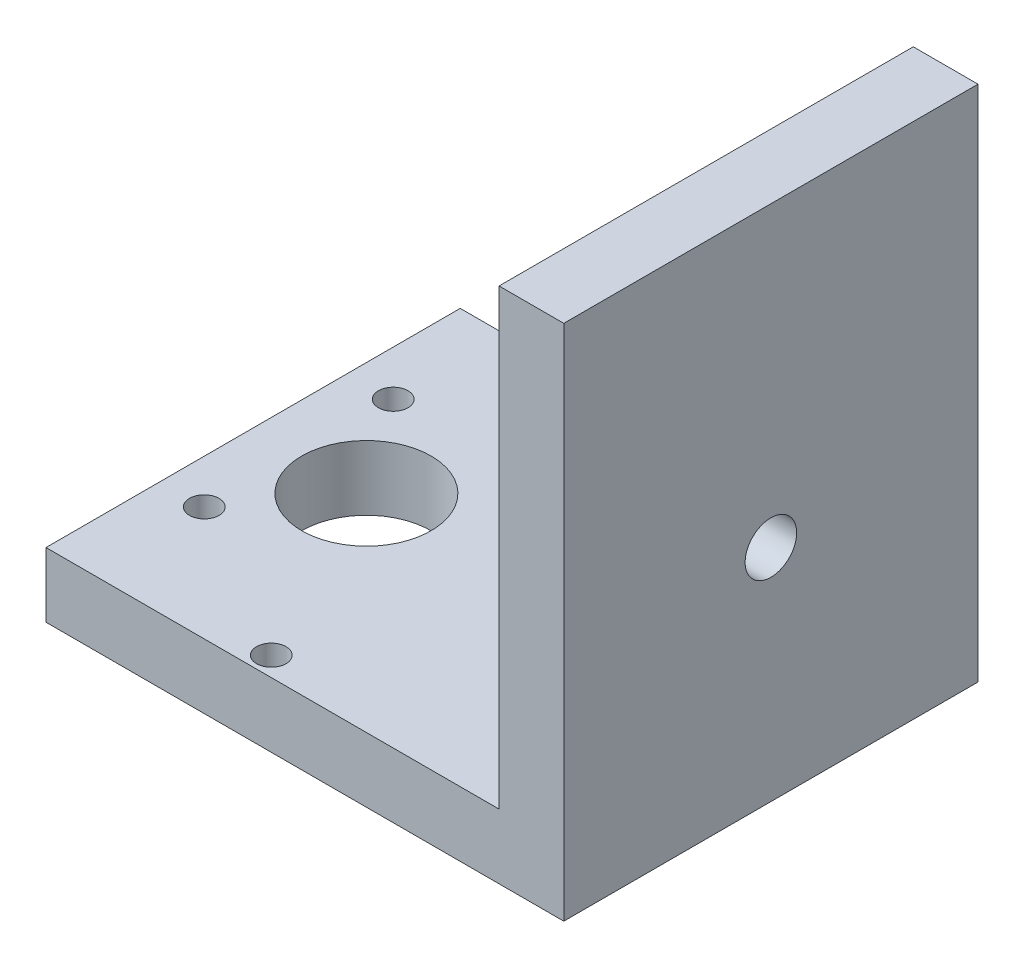
ISO-10303-21;
HEADER;
FILE_DESCRIPTION(('STEP AP214'),'2;1');
FILE_NAME('part.step','',(''),(''),'','','');
FILE_SCHEMA(('AUTOMOTIVE_DESIGN { 1 0 10303 214 1 1 1 1 }'));
ENDSEC;
DATA;
#1=APPLICATION_CONTEXT('core data for automotive mechanical design processes');
#2=APPLICATION_PROTOCOL_DEFINITION('international standard','automotive_design',2000,#1);
#3=PRODUCT_CONTEXT('',#1,'mechanical');
#4=PRODUCT('Part','Part','',(#3));
#5=PRODUCT_RELATED_PRODUCT_CATEGORY('part','',(#4));
#6=PRODUCT_DEFINITION_FORMATION('','',#4);
#7=PRODUCT_DEFINITION_CONTEXT('part definition',#1,'design');
#8=PRODUCT_DEFINITION('design','',#6,#7);
#9=PRODUCT_DEFINITION_SHAPE('','',#8);
#10=(LENGTH_UNIT() NAMED_UNIT(*) SI_UNIT(.MILLI.,.METRE.));
#11=(NAMED_UNIT(*) PLANE_ANGLE_UNIT() SI_UNIT($,.RADIAN.));
#12=(NAMED_UNIT(*) SI_UNIT($,.STERADIAN.) SOLID_ANGLE_UNIT());
#13=UNCERTAINTY_MEASURE_WITH_UNIT(LENGTH_MEASURE(1.E-05),#10,'distance_accuracy_value','');
#14=(GEOMETRIC_REPRESENTATION_CONTEXT(3) GLOBAL_UNCERTAINTY_ASSIGNED_CONTEXT((#13)) GLOBAL_UNIT_ASSIGNED_CONTEXT((#10,
#11,#12)) REPRESENTATION_CONTEXT('',''));
#15=CARTESIAN_POINT('',(0.,0.,0.));
#16=DIRECTION('',(0.,0.,1.));
#17=DIRECTION('',(1.,0.,0.));
#18=AXIS2_PLACEMENT_3D('',#15,#16,#17);
#19=CARTESIAN_POINT('',(14.3007462686567,21.9940298507463,40.64));
#20=DIRECTION('',(1.,0.,0.));
#21=DIRECTION('',(0.,1.,0.));
#22=AXIS2_PLACEMENT_3D('',#19,#20,#21);
#23=PLANE('',#22);
#24=CARTESIAN_POINT('',(14.3007462686567,-7.21597014925373,20.32));
#25=DIRECTION('',(1.,0.,0.));
#26=DIRECTION('',(0.,1.,0.));
#27=AXIS2_PLACEMENT_3D('',#24,#25,#26);
#28=CIRCLE('',#27,2.52729999999999);
#29=CARTESIAN_POINT('',(14.3007462686567,-4.68867014925374,20.32));
#30=VERTEX_POINT('',#29);
#31=EDGE_CURVE('E132',#30,#30,#28,.T.);
#32=ORIENTED_EDGE('',*,*,#31,.T.);
#33=EDGE_LOOP('',(#32));
#34=FACE_BOUND('',#33,.T.);
#35=DIRECTION('',(0.,-1.,0.));
#36=VECTOR('',#35,1.);
#37=CARTESIAN_POINT('',(14.3007462686567,21.9940298507463,0.));
#38=LINE('',#37,#36);
#39=CARTESIAN_POINT('',(14.3007462686567,21.9940298507463,0.));
#40=VERTEX_POINT('',#39);
#41=CARTESIAN_POINT('',(14.3007462686567,-22.4559701492537,0.));
#42=VERTEX_POINT('',#41);
#43=EDGE_CURVE('E128',#40,#42,#38,.T.);
#44=ORIENTED_EDGE('',*,*,#43,.T.);
#45=DIRECTION('',(0.,0.,-1.));
#46=VECTOR('',#45,1.);
#47=CARTESIAN_POINT('',(14.3007462686567,-22.4559701492537,40.64));
#48=LINE('',#47,#46);
#49=CARTESIAN_POINT('',(14.3007462686567,-22.4559701492537,40.64));
#50=VERTEX_POINT('',#49);
#51=EDGE_CURVE('E13',#50,#42,#48,.T.);
#52=ORIENTED_EDGE('',*,*,#51,.F.);
#53=DIRECTION('',(0.,-1.,0.));
#54=VECTOR('',#53,1.);
#55=CARTESIAN_POINT('',(14.3007462686567,21.9940298507463,40.64));
#56=LINE('',#55,#54);
#57=CARTESIAN_POINT('',(14.3007462686567,21.9940298507463,40.64));
#58=VERTEX_POINT('',#57);
#59=EDGE_CURVE('E140',#58,#50,#56,.T.);
#60=ORIENTED_EDGE('',*,*,#59,.F.);
#61=DIRECTION('',(0.,0.,-1.));
#62=VECTOR('',#61,1.);
#63=CARTESIAN_POINT('',(14.3007462686567,21.9940298507463,40.64));
#64=LINE('',#63,#62);
#65=EDGE_CURVE('E124',#58,#40,#64,.T.);
#66=ORIENTED_EDGE('',*,*,#65,.T.);
#67=EDGE_LOOP('',(#44,#52,#60,#66));
#68=FACE_BOUND('',#67,.T.);
#69=ADVANCED_FACE('F44',(#34,#68),#23,.F.);
#70=CARTESIAN_POINT('',(14.3007462686567,-22.4559701492537,40.64));
#71=DIRECTION('',(0.,-1.,0.));
#72=DIRECTION('',(1.,0.,0.));
#73=AXIS2_PLACEMENT_3D('',#70,#71,#72);
#74=PLANE('',#73);
#75=CARTESIAN_POINT('',(-25.7157823208983,-22.4559701492537,11.0070823920078));
#76=DIRECTION('',(0.,1.,0.));
#77=DIRECTION('',(0.,0.,1.));
#78=AXIS2_PLACEMENT_3D('',#75,#76,#77);
#79=CIRCLE('',#78,1.45);
#80=CARTESIAN_POINT('',(-25.7157823208983,-22.4559701492537,12.4570823920078));
#81=VERTEX_POINT('',#80);
#82=EDGE_CURVE('E218',#81,#81,#79,.T.);
#83=ORIENTED_EDGE('',*,*,#82,.F.);
#84=EDGE_LOOP('',(#83));
#85=FACE_BOUND('',#84,.T.);
#86=CARTESIAN_POINT('',(-25.8377412579935,-22.4559701492537,29.4216785325062));
#87=DIRECTION('',(0.,1.,0.));
#88=DIRECTION('',(0.,0.,1.));
#89=AXIS2_PLACEMENT_3D('',#86,#87,#88);
#90=CIRCLE('',#89,1.45);
#91=CARTESIAN_POINT('',(-25.8377412579935,-22.4559701492537,30.8716785325062));
#92=VERTEX_POINT('',#91);
#93=EDGE_CURVE('E212',#92,#92,#90,.T.);
#94=ORIENTED_EDGE('',*,*,#93,.F.);
#95=EDGE_LOOP('',(#94));
#96=FACE_BOUND('',#95,.T.);
#97=CARTESIAN_POINT('',(-9.95121266843853,-22.4559701492537,38.7345961404985));
#98=DIRECTION('',(0.,1.,0.));
#99=DIRECTION('',(0.,0.,1.));
#100=AXIS2_PLACEMENT_3D('',#97,#98,#99);
#101=CIRCLE('',#100,1.45);
#102=CARTESIAN_POINT('',(-9.95121266843853,-22.4559701492537,40.1845961404985));
#103=VERTEX_POINT('',#102);
#104=EDGE_CURVE('E206',#103,#103,#101,.T.);
#105=ORIENTED_EDGE('',*,*,#104,.F.);
#106=EDGE_LOOP('',(#105));
#107=FACE_BOUND('',#106,.T.);
#108=CARTESIAN_POINT('',(-9.70729479424805,-22.4559701492537,1.90540385950149));
#109=DIRECTION('',(0.,1.,0.));
#110=DIRECTION('',(0.,0.,1.));
#111=AXIS2_PLACEMENT_3D('',#108,#109,#110);
#112=CIRCLE('',#111,1.45);
#113=CARTESIAN_POINT('',(-9.70729479424805,-22.4559701492537,3.35540385950149));
#114=VERTEX_POINT('',#113);
#115=EDGE_CURVE('E200',#114,#114,#112,.T.);
#116=ORIENTED_EDGE('',*,*,#115,.F.);
#117=EDGE_LOOP('',(#116));
#118=FACE_BOUND('',#117,.T.);
#119=CARTESIAN_POINT('',(6.17923379530695,-22.4559701492537,11.2183214674938));
#120=DIRECTION('',(0.,1.,0.));
#121=DIRECTION('',(0.,0.,1.));
#122=AXIS2_PLACEMENT_3D('',#119,#120,#121);
#123=CIRCLE('',#122,1.45);
#124=CARTESIAN_POINT('',(6.17923379530695,-22.4559701492537,12.6683214674938));
#125=VERTEX_POINT('',#124);
#126=EDGE_CURVE('E194',#125,#125,#123,.T.);
#127=ORIENTED_EDGE('',*,*,#126,.F.);
#128=EDGE_LOOP('',(#127));
#129=FACE_BOUND('',#128,.T.);
#130=CARTESIAN_POINT('',(6.05727485821164,-22.4559701492537,29.6329176079924));
#131=DIRECTION('',(0.,1.,0.));
#132=DIRECTION('',(0.,0.,1.));
#133=AXIS2_PLACEMENT_3D('',#130,#131,#132);
#134=CIRCLE('',#133,1.45);
#135=CARTESIAN_POINT('',(6.05727485821164,-22.4559701492537,31.0829176079924));
#136=VERTEX_POINT('',#135);
#137=EDGE_CURVE('E188',#136,#136,#134,.T.);
#138=ORIENTED_EDGE('',*,*,#137,.F.);
#139=EDGE_LOOP('',(#138));
#140=FACE_BOUND('',#139,.T.);
#141=CARTESIAN_POINT('',(-19.0337525265426,-22.4559701492537,20.32));
#142=DIRECTION('',(0.,1.,0.));
#143=DIRECTION('',(-1.,0.,0.));
#144=AXIS2_PLACEMENT_3D('',#141,#142,#143);
#145=CIRCLE('',#144,6.35);
#146=CARTESIAN_POINT('',(-25.3837525265426,-22.4559701492537,20.32));
#147=VERTEX_POINT('',#146);
#148=EDGE_CURVE('E182',#147,#147,#145,.T.);
#149=ORIENTED_EDGE('',*,*,#148,.F.);
#150=EDGE_LOOP('',(#149));
#151=FACE_BOUND('',#150,.T.);
#152=DIRECTION('',(-1.,0.,0.));
#153=VECTOR('',#152,1.);
#154=CARTESIAN_POINT('',(14.3007462686567,-22.4559701492537,0.));
#155=LINE('',#154,#153);
#156=CARTESIAN_POINT('',(-30.1492537313433,-22.4559701492537,0.));
#157=VERTEX_POINT('',#156);
#158=EDGE_CURVE('E131',#42,#157,#155,.T.);
#159=ORIENTED_EDGE('',*,*,#158,.T.);
#160=DIRECTION('',(0.,0.,-1.));
#161=VECTOR('',#160,1.);
#162=CARTESIAN_POINT('',(-30.1492537313433,-22.4559701492537,40.64));
#163=LINE('',#162,#161);
#164=CARTESIAN_POINT('',(-30.1492537313433,-22.4559701492537,40.64));
#165=VERTEX_POINT('',#164);
#166=EDGE_CURVE('E53',#165,#157,#163,.T.);
#167=ORIENTED_EDGE('',*,*,#166,.F.);
#168=DIRECTION('',(-1.,0.,0.));
#169=VECTOR('',#168,1.);
#170=CARTESIAN_POINT('',(14.3007462686567,-22.4559701492537,40.64));
#171=LINE('',#170,#169);
#172=EDGE_CURVE('E98',#50,#165,#171,.T.);
#173=ORIENTED_EDGE('',*,*,#172,.F.);
#174=ORIENTED_EDGE('',*,*,#51,.T.);
#175=EDGE_LOOP('',(#159,#167,#173,#174));
#176=FACE_BOUND('',#175,.T.);
#177=ADVANCED_FACE('F166',(#85,#96,#107,#118,#129,#140,#151,#176),#74,.F.);
#178=CARTESIAN_POINT('',(-30.1492537313433,-28.8059701492537,40.64));
#179=DIRECTION('',(1.,0.,0.));
#180=DIRECTION('',(0.,0.,-1.));
#181=AXIS2_PLACEMENT_3D('',#178,#179,#180);
#182=PLANE('',#181);
#183=DIRECTION('',(0.,-1.,0.));
#184=VECTOR('',#183,1.);
#185=CARTESIAN_POINT('',(-30.1492537313433,-28.8059701492537,0.));
#186=LINE('',#185,#184);
#187=CARTESIAN_POINT('',(-30.1492537313433,-28.8059701492537,0.));
#188=VERTEX_POINT('',#187);
#189=EDGE_CURVE('E134',#157,#188,#186,.T.);
#190=ORIENTED_EDGE('',*,*,#189,.T.);
#191=DIRECTION('',(0.,0.,-1.));
#192=VECTOR('',#191,1.);
#193=CARTESIAN_POINT('',(-30.1492537313433,-28.8059701492537,40.64));
#194=LINE('',#193,#192);
#195=CARTESIAN_POINT('',(-30.1492537313433,-28.8059701492537,40.64));
#196=VERTEX_POINT('',#195);
#197=EDGE_CURVE('E119',#196,#188,#194,.T.);
#198=ORIENTED_EDGE('',*,*,#197,.F.);
#199=DIRECTION('',(0.,-1.,0.));
#200=VECTOR('',#199,1.);
#201=CARTESIAN_POINT('',(-30.1492537313433,-28.8059701492537,40.64));
#202=LINE('',#201,#200);
#203=EDGE_CURVE('E111',#165,#196,#202,.T.);
#204=ORIENTED_EDGE('',*,*,#203,.F.);
#205=ORIENTED_EDGE('',*,*,#166,.T.);
#206=EDGE_LOOP('',(#190,#198,#204,#205));
#207=FACE_BOUND('',#206,.T.);
#208=ADVANCED_FACE('F147',(#207),#182,.F.);
#209=CARTESIAN_POINT('',(9.22388059701493,-28.8059701492537,40.64));
#210=DIRECTION('',(0.,1.,0.));
#211=DIRECTION('',(-1.,0.,0.));
#212=AXIS2_PLACEMENT_3D('',#209,#210,#211);
#213=PLANE('',#212);
#214=CARTESIAN_POINT('',(-25.7157823208983,-28.8059701492538,11.0070823920078));
#215=DIRECTION('',(0.,1.,0.));
#216=DIRECTION('',(0.,0.,1.));
#217=AXIS2_PLACEMENT_3D('',#214,#215,#216);
#218=CIRCLE('',#217,1.45);
#219=CARTESIAN_POINT('',(-25.7157823208983,-28.8059701492538,12.4570823920078));
#220=VERTEX_POINT('',#219);
#221=EDGE_CURVE('E215',#220,#220,#218,.T.);
#222=ORIENTED_EDGE('',*,*,#221,.T.);
#223=EDGE_LOOP('',(#222));
#224=FACE_BOUND('',#223,.T.);
#225=CARTESIAN_POINT('',(-25.8377412579935,-28.8059701492538,29.4216785325062));
#226=DIRECTION('',(0.,1.,0.));
#227=DIRECTION('',(0.,0.,1.));
#228=AXIS2_PLACEMENT_3D('',#225,#226,#227);
#229=CIRCLE('',#228,1.45);
#230=CARTESIAN_POINT('',(-25.8377412579935,-28.8059701492538,30.8716785325062));
#231=VERTEX_POINT('',#230);
#232=EDGE_CURVE('E209',#231,#231,#229,.T.);
#233=ORIENTED_EDGE('',*,*,#232,.T.);
#234=EDGE_LOOP('',(#233));
#235=FACE_BOUND('',#234,.T.);
#236=CARTESIAN_POINT('',(-9.95121266843853,-28.8059701492538,38.7345961404985));
#237=DIRECTION('',(0.,1.,0.));
#238=DIRECTION('',(0.,0.,1.));
#239=AXIS2_PLACEMENT_3D('',#236,#237,#238);
#240=CIRCLE('',#239,1.45);
#241=CARTESIAN_POINT('',(-9.95121266843853,-28.8059701492538,40.1845961404985));
#242=VERTEX_POINT('',#241);
#243=EDGE_CURVE('E203',#242,#242,#240,.T.);
#244=ORIENTED_EDGE('',*,*,#243,.T.);
#245=EDGE_LOOP('',(#244));
#246=FACE_BOUND('',#245,.T.);
#247=CARTESIAN_POINT('',(-9.70729479424805,-28.8059701492538,1.90540385950149));
#248=DIRECTION('',(0.,1.,0.));
#249=DIRECTION('',(0.,0.,1.));
#250=AXIS2_PLACEMENT_3D('',#247,#248,#249);
#251=CIRCLE('',#250,1.45);
#252=CARTESIAN_POINT('',(-9.70729479424805,-28.8059701492538,3.35540385950149));
#253=VERTEX_POINT('',#252);
#254=EDGE_CURVE('E197',#253,#253,#251,.T.);
#255=ORIENTED_EDGE('',*,*,#254,.T.);
#256=EDGE_LOOP('',(#255));
#257=FACE_BOUND('',#256,.T.);
#258=CARTESIAN_POINT('',(6.17923379530695,-28.8059701492538,11.2183214674938));
#259=DIRECTION('',(0.,1.,0.));
#260=DIRECTION('',(0.,0.,1.));
#261=AXIS2_PLACEMENT_3D('',#258,#259,#260);
#262=CIRCLE('',#261,1.45);
#263=CARTESIAN_POINT('',(6.17923379530695,-28.8059701492538,12.6683214674938));
#264=VERTEX_POINT('',#263);
#265=EDGE_CURVE('E191',#264,#264,#262,.T.);
#266=ORIENTED_EDGE('',*,*,#265,.T.);
#267=EDGE_LOOP('',(#266));
#268=FACE_BOUND('',#267,.T.);
#269=CARTESIAN_POINT('',(6.05727485821164,-28.8059701492538,29.6329176079924));
#270=DIRECTION('',(0.,1.,0.));
#271=DIRECTION('',(0.,0.,1.));
#272=AXIS2_PLACEMENT_3D('',#269,#270,#271);
#273=CIRCLE('',#272,1.45);
#274=CARTESIAN_POINT('',(6.05727485821164,-28.8059701492538,31.0829176079924));
#275=VERTEX_POINT('',#274);
#276=EDGE_CURVE('E185',#275,#275,#273,.T.);
#277=ORIENTED_EDGE('',*,*,#276,.T.);
#278=EDGE_LOOP('',(#277));
#279=FACE_BOUND('',#278,.T.);
#280=CARTESIAN_POINT('',(-19.0337525265426,-28.8059701492538,20.32));
#281=DIRECTION('',(0.,1.,0.));
#282=DIRECTION('',(-1.,0.,0.));
#283=AXIS2_PLACEMENT_3D('',#280,#281,#282);
#284=CIRCLE('',#283,6.35);
#285=CARTESIAN_POINT('',(-25.3837525265426,-28.8059701492538,20.32));
#286=VERTEX_POINT('',#285);
#287=EDGE_CURVE('E47',#286,#286,#284,.T.);
#288=ORIENTED_EDGE('',*,*,#287,.T.);
#289=EDGE_LOOP('',(#288));
#290=FACE_BOUND('',#289,.T.);
#291=DIRECTION('',(1.,0.,0.));
#292=VECTOR('',#291,1.);
#293=CARTESIAN_POINT('',(9.22388059701493,-28.8059701492537,0.));
#294=LINE('',#293,#292);
#295=CARTESIAN_POINT('',(20.6507462686567,-28.8059701492537,0.));
#296=VERTEX_POINT('',#295);
#297=EDGE_CURVE('E118',#188,#296,#294,.T.);
#298=ORIENTED_EDGE('',*,*,#297,.T.);
#299=DIRECTION('',(0.,0.,-1.));
#300=VECTOR('',#299,1.);
#301=CARTESIAN_POINT('',(20.6507462686567,-28.8059701492537,40.64));
#302=LINE('',#301,#300);
#303=CARTESIAN_POINT('',(20.6507462686567,-28.8059701492537,40.64));
#304=VERTEX_POINT('',#303);
#305=EDGE_CURVE('E116',#304,#296,#302,.T.);
#306=ORIENTED_EDGE('',*,*,#305,.F.);
#307=DIRECTION('',(1.,0.,0.));
#308=VECTOR('',#307,1.);
#309=CARTESIAN_POINT('',(9.22388059701493,-28.8059701492537,40.64));
#310=LINE('',#309,#308);
#311=EDGE_CURVE('E105',#196,#304,#310,.T.);
#312=ORIENTED_EDGE('',*,*,#311,.F.);
#313=ORIENTED_EDGE('',*,*,#197,.T.);
#314=EDGE_LOOP('',(#298,#306,#312,#313));
#315=FACE_BOUND('',#314,.T.);
#316=ADVANCED_FACE('F117',(#224,#235,#246,#257,#268,#279,#290,#315),#213,.F.);
#317=CARTESIAN_POINT('',(20.6507462686567,21.9940298507463,40.64));
#318=DIRECTION('',(-1.,0.,0.));
#319=DIRECTION('',(0.,-1.,0.));
#320=AXIS2_PLACEMENT_3D('',#317,#318,#319);
#321=PLANE('',#320);
#322=CARTESIAN_POINT('',(20.6507462686567,-7.21597014925373,20.32));
#323=DIRECTION('',(1.,0.,0.));
#324=DIRECTION('',(0.,0.,-1.));
#325=AXIS2_PLACEMENT_3D('',#322,#323,#324);
#326=CIRCLE('',#325,2.52729999999999);
#327=CARTESIAN_POINT('',(20.6507462686567,-7.21597014925373,17.7927));
#328=VERTEX_POINT('',#327);
#329=EDGE_CURVE('E175',#328,#328,#326,.T.);
#330=ORIENTED_EDGE('',*,*,#329,.F.);
#331=EDGE_LOOP('',(#330));
#332=FACE_BOUND('',#331,.T.);
#333=DIRECTION('',(0.,1.,0.));
#334=VECTOR('',#333,1.);
#335=CARTESIAN_POINT('',(20.6507462686567,21.9940298507463,0.));
#336=LINE('',#335,#334);
#337=CARTESIAN_POINT('',(20.6507462686567,21.9940298507463,0.));
#338=VERTEX_POINT('',#337);
#339=EDGE_CURVE('E84',#296,#338,#336,.T.);
#340=ORIENTED_EDGE('',*,*,#339,.T.);
#341=DIRECTION('',(0.,0.,-1.));
#342=VECTOR('',#341,1.);
#343=CARTESIAN_POINT('',(20.6507462686567,21.9940298507463,40.64));
#344=LINE('',#343,#342);
#345=CARTESIAN_POINT('',(20.6507462686567,21.9940298507463,40.64));
#346=VERTEX_POINT('',#345);
#347=EDGE_CURVE('E120',#346,#338,#344,.T.);
#348=ORIENTED_EDGE('',*,*,#347,.F.);
#349=DIRECTION('',(0.,1.,0.));
#350=VECTOR('',#349,1.);
#351=CARTESIAN_POINT('',(20.6507462686567,21.9940298507463,40.64));
#352=LINE('',#351,#350);
#353=EDGE_CURVE('E109',#304,#346,#352,.T.);
#354=ORIENTED_EDGE('',*,*,#353,.F.);
#355=ORIENTED_EDGE('',*,*,#305,.T.);
#356=EDGE_LOOP('',(#340,#348,#354,#355));
#357=FACE_BOUND('',#356,.T.);
#358=ADVANCED_FACE('F122',(#332,#357),#321,.F.);
#359=CARTESIAN_POINT('',(14.3007462686567,21.9940298507463,40.64));
#360=DIRECTION('',(0.,-1.,0.));
#361=DIRECTION('',(0.,0.,-1.));
#362=AXIS2_PLACEMENT_3D('',#359,#360,#361);
#363=PLANE('',#362);
#364=DIRECTION('',(-1.,0.,0.));
#365=VECTOR('',#364,1.);
#366=CARTESIAN_POINT('',(14.3007462686567,21.9940298507463,0.));
#367=LINE('',#366,#365);
#368=EDGE_CURVE('E90',#338,#40,#367,.T.);
#369=ORIENTED_EDGE('',*,*,#368,.T.);
#370=ORIENTED_EDGE('',*,*,#65,.F.);
#371=DIRECTION('',(-1.,0.,0.));
#372=VECTOR('',#371,1.);
#373=CARTESIAN_POINT('',(14.3007462686567,21.9940298507463,40.64));
#374=LINE('',#373,#372);
#375=EDGE_CURVE('E61',#346,#58,#374,.T.);
#376=ORIENTED_EDGE('',*,*,#375,.F.);
#377=ORIENTED_EDGE('',*,*,#347,.T.);
#378=EDGE_LOOP('',(#369,#370,#376,#377));
#379=FACE_BOUND('',#378,.T.);
#380=ADVANCED_FACE('F154',(#379),#363,.F.);
#381=CARTESIAN_POINT('',(0.,0.,40.64));
#382=DIRECTION('',(0.,0.,-1.));
#383=DIRECTION('',(-1.,0.,0.));
#384=AXIS2_PLACEMENT_3D('',#381,#382,#383);
#385=PLANE('',#384);
#386=ORIENTED_EDGE('',*,*,#59,.T.);
#387=ORIENTED_EDGE('',*,*,#172,.T.);
#388=ORIENTED_EDGE('',*,*,#203,.T.);
#389=ORIENTED_EDGE('',*,*,#311,.T.);
#390=ORIENTED_EDGE('',*,*,#353,.T.);
#391=ORIENTED_EDGE('',*,*,#375,.T.);
#392=EDGE_LOOP('',(#386,#387,#388,#389,#390,#391));
#393=FACE_BOUND('',#392,.T.);
#394=ADVANCED_FACE('F107',(#393),#385,.F.);
#395=CARTESIAN_POINT('',(0.,0.,0.));
#396=DIRECTION('',(0.,0.,-1.));
#397=DIRECTION('',(-1.,0.,0.));
#398=AXIS2_PLACEMENT_3D('',#395,#396,#397);
#399=PLANE('',#398);
#400=ORIENTED_EDGE('',*,*,#43,.F.);
#401=ORIENTED_EDGE('',*,*,#368,.F.);
#402=ORIENTED_EDGE('',*,*,#339,.F.);
#403=ORIENTED_EDGE('',*,*,#297,.F.);
#404=ORIENTED_EDGE('',*,*,#189,.F.);
#405=ORIENTED_EDGE('',*,*,#158,.F.);
#406=EDGE_LOOP('',(#400,#401,#402,#403,#404,#405));
#407=FACE_BOUND('',#406,.T.);
#408=ADVANCED_FACE('F150',(#407),#399,.T.);
#409=CARTESIAN_POINT('',(20.6507462686567,-7.21597014925373,20.32));
#410=DIRECTION('',(1.,0.,0.));
#411=DIRECTION('',(0.,0.,-1.));
#412=AXIS2_PLACEMENT_3D('',#409,#410,#411);
#413=CYLINDRICAL_SURFACE('',#412,2.52729999999999);
#414=ORIENTED_EDGE('',*,*,#329,.T.);
#415=EDGE_LOOP('',(#414));
#416=FACE_BOUND('',#415,.T.);
#417=ORIENTED_EDGE('',*,*,#31,.F.);
#418=EDGE_LOOP('',(#417));
#419=FACE_BOUND('',#418,.T.);
#420=ADVANCED_FACE('F240',(#416,#419),#413,.F.);
#421=CARTESIAN_POINT('',(-19.0337525265426,-63.0959701492537,20.32));
#422=DIRECTION('',(0.,1.,0.));
#423=DIRECTION('',(-1.,0.,0.));
#424=AXIS2_PLACEMENT_3D('',#421,#422,#423);
#425=CYLINDRICAL_SURFACE('',#424,6.35);
#426=ORIENTED_EDGE('',*,*,#148,.T.);
#427=EDGE_LOOP('',(#426));
#428=FACE_BOUND('',#427,.T.);
#429=ORIENTED_EDGE('',*,*,#287,.F.);
#430=EDGE_LOOP('',(#429));
#431=FACE_BOUND('',#430,.T.);
#432=ADVANCED_FACE('F236',(#428,#431),#425,.F.);
#433=CARTESIAN_POINT('',(6.05727485821164,-22.4559701492537,29.6329176079924));
#434=DIRECTION('',(0.,1.,0.));
#435=DIRECTION('',(0.,0.,1.));
#436=AXIS2_PLACEMENT_3D('',#433,#434,#435);
#437=CYLINDRICAL_SURFACE('',#436,1.45);
#438=ORIENTED_EDGE('',*,*,#276,.F.);
#439=EDGE_LOOP('',(#438));
#440=FACE_BOUND('',#439,.T.);
#441=ORIENTED_EDGE('',*,*,#137,.T.);
#442=EDGE_LOOP('',(#441));
#443=FACE_BOUND('',#442,.T.);
#444=ADVANCED_FACE('F239',(#440,#443),#437,.F.);
#445=CARTESIAN_POINT('',(6.17923379530695,-22.4559701492537,11.2183214674938));
#446=DIRECTION('',(0.,1.,0.));
#447=DIRECTION('',(0.,0.,1.));
#448=AXIS2_PLACEMENT_3D('',#445,#446,#447);
#449=CYLINDRICAL_SURFACE('',#448,1.45);
#450=ORIENTED_EDGE('',*,*,#265,.F.);
#451=EDGE_LOOP('',(#450));
#452=FACE_BOUND('',#451,.T.);
#453=ORIENTED_EDGE('',*,*,#126,.T.);
#454=EDGE_LOOP('',(#453));
#455=FACE_BOUND('',#454,.T.);
#456=ADVANCED_FACE('F266',(#452,#455),#449,.F.);
#457=CARTESIAN_POINT('',(-9.70729479424805,-22.4559701492537,1.90540385950149));
#458=DIRECTION('',(0.,1.,0.));
#459=DIRECTION('',(0.,0.,1.));
#460=AXIS2_PLACEMENT_3D('',#457,#458,#459);
#461=CYLINDRICAL_SURFACE('',#460,1.45);
#462=ORIENTED_EDGE('',*,*,#254,.F.);
#463=EDGE_LOOP('',(#462));
#464=FACE_BOUND('',#463,.T.);
#465=ORIENTED_EDGE('',*,*,#115,.T.);
#466=EDGE_LOOP('',(#465));
#467=FACE_BOUND('',#466,.T.);
#468=ADVANCED_FACE('F271',(#464,#467),#461,.F.);
#469=CARTESIAN_POINT('',(-9.95121266843853,-22.4559701492537,38.7345961404985));
#470=DIRECTION('',(0.,1.,0.));
#471=DIRECTION('',(0.,0.,1.));
#472=AXIS2_PLACEMENT_3D('',#469,#470,#471);
#473=CYLINDRICAL_SURFACE('',#472,1.45);
#474=ORIENTED_EDGE('',*,*,#243,.F.);
#475=EDGE_LOOP('',(#474));
#476=FACE_BOUND('',#475,.T.);
#477=ORIENTED_EDGE('',*,*,#104,.T.);
#478=EDGE_LOOP('',(#477));
#479=FACE_BOUND('',#478,.T.);
#480=ADVANCED_FACE('F325',(#476,#479),#473,.F.);
#481=CARTESIAN_POINT('',(-25.8377412579935,-22.4559701492537,29.4216785325062));
#482=DIRECTION('',(0.,1.,0.));
#483=DIRECTION('',(0.,0.,1.));
#484=AXIS2_PLACEMENT_3D('',#481,#482,#483);
#485=CYLINDRICAL_SURFACE('',#484,1.45);
#486=ORIENTED_EDGE('',*,*,#232,.F.);
#487=EDGE_LOOP('',(#486));
#488=FACE_BOUND('',#487,.T.);
#489=ORIENTED_EDGE('',*,*,#93,.T.);
#490=EDGE_LOOP('',(#489));
#491=FACE_BOUND('',#490,.T.);
#492=ADVANCED_FACE('F334',(#488,#491),#485,.F.);
#493=CARTESIAN_POINT('',(-25.7157823208983,-22.4559701492537,11.0070823920078));
#494=DIRECTION('',(0.,1.,0.));
#495=DIRECTION('',(0.,0.,1.));
#496=AXIS2_PLACEMENT_3D('',#493,#494,#495);
#497=CYLINDRICAL_SURFACE('',#496,1.45);
#498=ORIENTED_EDGE('',*,*,#221,.F.);
#499=EDGE_LOOP('',(#498));
#500=FACE_BOUND('',#499,.T.);
#501=ORIENTED_EDGE('',*,*,#82,.T.);
#502=EDGE_LOOP('',(#501));
#503=FACE_BOUND('',#502,.T.);
#504=ADVANCED_FACE('F222',(#500,#503),#497,.F.);
#505=CLOSED_SHELL('',(#69,#177,#208,#316,#358,#380,#394,#408,#420,#432,#444,#456,#468,#480,#492,#504));
#506=MANIFOLD_SOLID_BREP('B2',#505);
#507=ADVANCED_BREP_SHAPE_REPRESENTATION('',(#18,#506),#14);
#508=SHAPE_DEFINITION_REPRESENTATION(#9,#507);
ENDSEC;
END-ISO-10303-21;
